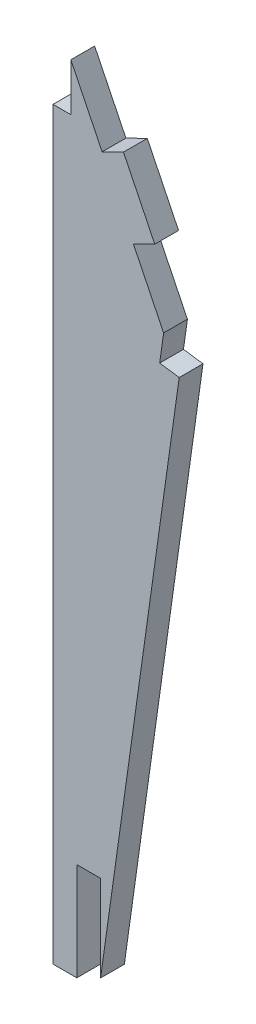
ISO-10303-21;
HEADER;
FILE_DESCRIPTION(('STEP AP214'),'2;1');
FILE_NAME('part.step','',(''),(''),'','','');
FILE_SCHEMA(('AUTOMOTIVE_DESIGN { 1 0 10303 214 1 1 1 1 }'));
ENDSEC;
DATA;
#1=APPLICATION_CONTEXT('core data for automotive mechanical design processes');
#2=APPLICATION_PROTOCOL_DEFINITION('international standard','automotive_design',2000,#1);
#3=PRODUCT_CONTEXT('',#1,'mechanical');
#4=PRODUCT('Part','Part','',(#3));
#5=PRODUCT_RELATED_PRODUCT_CATEGORY('part','',(#4));
#6=PRODUCT_DEFINITION_FORMATION('','',#4);
#7=PRODUCT_DEFINITION_CONTEXT('part definition',#1,'design');
#8=PRODUCT_DEFINITION('design','',#6,#7);
#9=PRODUCT_DEFINITION_SHAPE('','',#8);
#10=(LENGTH_UNIT() NAMED_UNIT(*) SI_UNIT(.MILLI.,.METRE.));
#11=(NAMED_UNIT(*) PLANE_ANGLE_UNIT() SI_UNIT($,.RADIAN.));
#12=(NAMED_UNIT(*) SI_UNIT($,.STERADIAN.) SOLID_ANGLE_UNIT());
#13=UNCERTAINTY_MEASURE_WITH_UNIT(LENGTH_MEASURE(1.E-05),#10,'distance_accuracy_value','');
#14=(GEOMETRIC_REPRESENTATION_CONTEXT(3) GLOBAL_UNCERTAINTY_ASSIGNED_CONTEXT((#13)) GLOBAL_UNIT_ASSIGNED_CONTEXT((#10,
#11,#12)) REPRESENTATION_CONTEXT('',''));
#15=CARTESIAN_POINT('',(0.,0.,0.));
#16=DIRECTION('',(0.,0.,1.));
#17=DIRECTION('',(1.,0.,0.));
#18=AXIS2_PLACEMENT_3D('',#15,#16,#17);
#19=CARTESIAN_POINT('',(17.3434518325957,74.7027953008437,2.));
#20=DIRECTION('',(-0.898794046260025,-0.438371146869329,0.));
#21=DIRECTION('',(0.438371146869329,-0.898794046260025,0.));
#22=AXIS2_PLACEMENT_3D('',#19,#20,#21);
#23=PLANE('',#22);
#24=DIRECTION('',(-0.438371146869329,0.898794046260025,0.));
#25=VECTOR('',#24,1.);
#26=CARTESIAN_POINT('',(17.3434518325957,74.7027953008437,0.));
#27=LINE('',#26,#25);
#28=CARTESIAN_POINT('',(19.9736787138118,69.3100310232835,0.));
#29=VERTEX_POINT('',#28);
#30=CARTESIAN_POINT('',(17.3434518325957,74.7027953008437,0.));
#31=VERTEX_POINT('',#30);
#32=EDGE_CURVE('E174',#29,#31,#27,.T.);
#33=ORIENTED_EDGE('',*,*,#32,.T.);
#34=DIRECTION('',(0.,0.,-1.));
#35=VECTOR('',#34,1.);
#36=CARTESIAN_POINT('',(17.3434518325957,74.7027953008437,2.));
#37=LINE('',#36,#35);
#38=CARTESIAN_POINT('',(17.3434518325957,74.7027953008437,2.));
#39=VERTEX_POINT('',#38);
#40=EDGE_CURVE('E11',#39,#31,#37,.T.);
#41=ORIENTED_EDGE('',*,*,#40,.F.);
#42=DIRECTION('',(-0.438371146869329,0.898794046260025,0.));
#43=VECTOR('',#42,1.);
#44=CARTESIAN_POINT('',(17.3434518325957,74.7027953008437,2.));
#45=LINE('',#44,#43);
#46=CARTESIAN_POINT('',(19.9736787138118,69.3100310232835,2.));
#47=VERTEX_POINT('',#46);
#48=EDGE_CURVE('E202',#47,#39,#45,.T.);
#49=ORIENTED_EDGE('',*,*,#48,.F.);
#50=DIRECTION('',(0.,0.,-1.));
#51=VECTOR('',#50,1.);
#52=CARTESIAN_POINT('',(19.9736787138118,69.3100310232835,2.));
#53=LINE('',#52,#51);
#54=EDGE_CURVE('E170',#47,#29,#53,.T.);
#55=ORIENTED_EDGE('',*,*,#54,.T.);
#56=EDGE_LOOP('',(#33,#41,#49,#55));
#57=FACE_BOUND('',#56,.T.);
#58=ADVANCED_FACE('F36',(#57),#23,.F.);
#59=CARTESIAN_POINT('',(17.3434518325957,74.7027953008437,2.));
#60=DIRECTION('',(1.,0.,0.));
#61=DIRECTION('',(0.,0.,-1.));
#62=AXIS2_PLACEMENT_3D('',#59,#60,#61);
#63=PLANE('',#62);
#64=DIRECTION('',(0.,-1.,0.));
#65=VECTOR('',#64,1.);
#66=CARTESIAN_POINT('',(17.3434518325957,74.7027953008437,0.));
#67=LINE('',#66,#65);
#68=CARTESIAN_POINT('',(17.3434518325957,70.7027953008437,0.));
#69=VERTEX_POINT('',#68);
#70=EDGE_CURVE('E177',#31,#69,#67,.T.);
#71=ORIENTED_EDGE('',*,*,#70,.T.);
#72=DIRECTION('',(0.,0.,-1.));
#73=VECTOR('',#72,1.);
#74=CARTESIAN_POINT('',(17.3434518325957,70.7027953008437,2.));
#75=LINE('',#74,#73);
#76=CARTESIAN_POINT('',(17.3434518325957,70.7027953008437,2.));
#77=VERTEX_POINT('',#76);
#78=EDGE_CURVE('E44',#77,#69,#75,.T.);
#79=ORIENTED_EDGE('',*,*,#78,.F.);
#80=DIRECTION('',(0.,-1.,0.));
#81=VECTOR('',#80,1.);
#82=CARTESIAN_POINT('',(17.3434518325957,74.7027953008437,2.));
#83=LINE('',#82,#81);
#84=EDGE_CURVE('E116',#39,#77,#83,.T.);
#85=ORIENTED_EDGE('',*,*,#84,.F.);
#86=ORIENTED_EDGE('',*,*,#40,.T.);
#87=EDGE_LOOP('',(#71,#79,#85,#86));
#88=FACE_BOUND('',#87,.T.);
#89=ADVANCED_FACE('F295',(#88),#63,.F.);
#90=CARTESIAN_POINT('',(17.3434518325957,70.7027953008437,2.));
#91=DIRECTION('',(0.,-1.,0.));
#92=DIRECTION('',(0.,0.,-1.));
#93=AXIS2_PLACEMENT_3D('',#90,#91,#92);
#94=PLANE('',#93);
#95=DIRECTION('',(-1.,0.,0.));
#96=VECTOR('',#95,1.);
#97=CARTESIAN_POINT('',(17.3434518325957,70.7027953008437,0.));
#98=LINE('',#97,#96);
#99=CARTESIAN_POINT('',(15.8434518325957,70.7027953008437,0.));
#100=VERTEX_POINT('',#99);
#101=EDGE_CURVE('E179',#69,#100,#98,.T.);
#102=ORIENTED_EDGE('',*,*,#101,.T.);
#103=DIRECTION('',(0.,0.,-1.));
#104=VECTOR('',#103,1.);
#105=CARTESIAN_POINT('',(15.8434518325957,70.7027953008437,2.));
#106=LINE('',#105,#104);
#107=CARTESIAN_POINT('',(15.8434518325957,70.7027953008437,2.));
#108=VERTEX_POINT('',#107);
#109=EDGE_CURVE('E230',#108,#100,#106,.T.);
#110=ORIENTED_EDGE('',*,*,#109,.F.);
#111=DIRECTION('',(-1.,0.,0.));
#112=VECTOR('',#111,1.);
#113=CARTESIAN_POINT('',(17.3434518325957,70.7027953008437,2.));
#114=LINE('',#113,#112);
#115=EDGE_CURVE('E238',#77,#108,#114,.T.);
#116=ORIENTED_EDGE('',*,*,#115,.F.);
#117=ORIENTED_EDGE('',*,*,#78,.T.);
#118=EDGE_LOOP('',(#102,#110,#116,#117));
#119=FACE_BOUND('',#118,.T.);
#120=ADVANCED_FACE('F236',(#119),#94,.F.);
#121=CARTESIAN_POINT('',(15.8434518325957,70.7027953008437,2.));
#122=DIRECTION('',(1.,0.,0.));
#123=DIRECTION('',(0.,0.,-1.));
#124=AXIS2_PLACEMENT_3D('',#121,#122,#123);
#125=PLANE('',#124);
#126=DIRECTION('',(0.,-1.,0.));
#127=VECTOR('',#126,1.);
#128=CARTESIAN_POINT('',(15.8434518325957,70.7027953008437,0.));
#129=LINE('',#128,#127);
#130=CARTESIAN_POINT('',(15.8434518325957,8.08014643010893,0.));
#131=VERTEX_POINT('',#130);
#132=EDGE_CURVE('E181',#100,#131,#129,.T.);
#133=ORIENTED_EDGE('',*,*,#132,.T.);
#134=DIRECTION('',(0.,0.,-1.));
#135=VECTOR('',#134,1.);
#136=CARTESIAN_POINT('',(15.8434518325957,8.08014643010893,2.));
#137=LINE('',#136,#135);
#138=CARTESIAN_POINT('',(15.8434518325957,8.08014643010893,2.));
#139=VERTEX_POINT('',#138);
#140=EDGE_CURVE('E227',#139,#131,#137,.T.);
#141=ORIENTED_EDGE('',*,*,#140,.F.);
#142=DIRECTION('',(0.,-1.,0.));
#143=VECTOR('',#142,1.);
#144=CARTESIAN_POINT('',(15.8434518325957,70.7027953008437,2.));
#145=LINE('',#144,#143);
#146=EDGE_CURVE('E256',#108,#139,#145,.T.);
#147=ORIENTED_EDGE('',*,*,#146,.F.);
#148=ORIENTED_EDGE('',*,*,#109,.T.);
#149=EDGE_LOOP('',(#133,#141,#147,#148));
#150=FACE_BOUND('',#149,.T.);
#151=ADVANCED_FACE('F247',(#150),#125,.F.);
#152=CARTESIAN_POINT('',(15.8434518325957,8.08014643010893,2.));
#153=DIRECTION('',(0.,1.,0.));
#154=DIRECTION('',(0.,0.,1.));
#155=AXIS2_PLACEMENT_3D('',#152,#153,#154);
#156=PLANE('',#155);
#157=DIRECTION('',(1.,0.,0.));
#158=VECTOR('',#157,1.);
#159=CARTESIAN_POINT('',(15.8434518325957,8.08014643010893,0.));
#160=LINE('',#159,#158);
#161=CARTESIAN_POINT('',(17.8434518325958,8.08014643010893,0.));
#162=VERTEX_POINT('',#161);
#163=EDGE_CURVE('E183',#131,#162,#160,.T.);
#164=ORIENTED_EDGE('',*,*,#163,.T.);
#165=DIRECTION('',(0.,0.,-1.));
#166=VECTOR('',#165,1.);
#167=CARTESIAN_POINT('',(17.8434518325958,8.08014643010893,2.));
#168=LINE('',#167,#166);
#169=CARTESIAN_POINT('',(17.8434518325958,8.08014643010893,2.));
#170=VERTEX_POINT('',#169);
#171=EDGE_CURVE('E224',#170,#162,#168,.T.);
#172=ORIENTED_EDGE('',*,*,#171,.F.);
#173=DIRECTION('',(1.,0.,0.));
#174=VECTOR('',#173,1.);
#175=CARTESIAN_POINT('',(15.8434518325957,8.08014643010893,2.));
#176=LINE('',#175,#174);
#177=EDGE_CURVE('E253',#139,#170,#176,.T.);
#178=ORIENTED_EDGE('',*,*,#177,.F.);
#179=ORIENTED_EDGE('',*,*,#140,.T.);
#180=EDGE_LOOP('',(#164,#172,#178,#179));
#181=FACE_BOUND('',#180,.T.);
#182=ADVANCED_FACE('F251',(#181),#156,.F.);
#183=CARTESIAN_POINT('',(17.8434518325958,8.08014643010893,2.));
#184=DIRECTION('',(-1.,0.,0.));
#185=DIRECTION('',(0.,0.,1.));
#186=AXIS2_PLACEMENT_3D('',#183,#184,#185);
#187=PLANE('',#186);
#188=DIRECTION('',(0.,1.,0.));
#189=VECTOR('',#188,1.);
#190=CARTESIAN_POINT('',(17.8434518325958,8.08014643010893,0.));
#191=LINE('',#190,#189);
#192=CARTESIAN_POINT('',(17.8434518325958,16.3301464301089,0.));
#193=VERTEX_POINT('',#192);
#194=EDGE_CURVE('E185',#162,#193,#191,.T.);
#195=ORIENTED_EDGE('',*,*,#194,.T.);
#196=DIRECTION('',(0.,0.,-1.));
#197=VECTOR('',#196,1.);
#198=CARTESIAN_POINT('',(17.8434518325958,16.3301464301089,2.));
#199=LINE('',#198,#197);
#200=CARTESIAN_POINT('',(17.8434518325958,16.3301464301089,2.));
#201=VERTEX_POINT('',#200);
#202=EDGE_CURVE('E221',#201,#193,#199,.T.);
#203=ORIENTED_EDGE('',*,*,#202,.F.);
#204=DIRECTION('',(0.,1.,0.));
#205=VECTOR('',#204,1.);
#206=CARTESIAN_POINT('',(17.8434518325958,8.08014643010893,2.));
#207=LINE('',#206,#205);
#208=EDGE_CURVE('E255',#170,#201,#207,.T.);
#209=ORIENTED_EDGE('',*,*,#208,.F.);
#210=ORIENTED_EDGE('',*,*,#171,.T.);
#211=EDGE_LOOP('',(#195,#203,#209,#210));
#212=FACE_BOUND('',#211,.T.);
#213=ADVANCED_FACE('F308',(#212),#187,.F.);
#214=CARTESIAN_POINT('',(17.8434518325958,16.3301464301089,2.));
#215=DIRECTION('',(0.,1.,0.));
#216=DIRECTION('',(0.,0.,1.));
#217=AXIS2_PLACEMENT_3D('',#214,#215,#216);
#218=PLANE('',#217);
#219=DIRECTION('',(1.,0.,0.));
#220=VECTOR('',#219,1.);
#221=CARTESIAN_POINT('',(17.8434518325958,16.3301464301089,0.));
#222=LINE('',#221,#220);
#223=CARTESIAN_POINT('',(19.8434518325957,16.3301464301089,0.));
#224=VERTEX_POINT('',#223);
#225=EDGE_CURVE('E187',#193,#224,#222,.T.);
#226=ORIENTED_EDGE('',*,*,#225,.T.);
#227=DIRECTION('',(0.,0.,-1.));
#228=VECTOR('',#227,1.);
#229=CARTESIAN_POINT('',(19.8434518325957,16.3301464301089,2.));
#230=LINE('',#229,#228);
#231=CARTESIAN_POINT('',(19.8434518325957,16.3301464301089,2.));
#232=VERTEX_POINT('',#231);
#233=EDGE_CURVE('E218',#232,#224,#230,.T.);
#234=ORIENTED_EDGE('',*,*,#233,.F.);
#235=DIRECTION('',(1.,0.,0.));
#236=VECTOR('',#235,1.);
#237=CARTESIAN_POINT('',(17.8434518325958,16.3301464301089,2.));
#238=LINE('',#237,#236);
#239=EDGE_CURVE('E258',#201,#232,#238,.T.);
#240=ORIENTED_EDGE('',*,*,#239,.F.);
#241=ORIENTED_EDGE('',*,*,#202,.T.);
#242=EDGE_LOOP('',(#226,#234,#240,#241));
#243=FACE_BOUND('',#242,.T.);
#244=ADVANCED_FACE('F311',(#243),#218,.F.);
#245=CARTESIAN_POINT('',(19.8434518325957,16.3301464301089,2.));
#246=DIRECTION('',(1.,0.,0.));
#247=DIRECTION('',(0.,0.,-1.));
#248=AXIS2_PLACEMENT_3D('',#245,#246,#247);
#249=PLANE('',#248);
#250=DIRECTION('',(0.,-1.,0.));
#251=VECTOR('',#250,1.);
#252=CARTESIAN_POINT('',(19.8434518325957,16.3301464301089,0.));
#253=LINE('',#252,#251);
#254=CARTESIAN_POINT('',(19.8434518325957,9.06845485355871,0.));
#255=VERTEX_POINT('',#254);
#256=EDGE_CURVE('E189',#224,#255,#253,.T.);
#257=ORIENTED_EDGE('',*,*,#256,.T.);
#258=DIRECTION('',(0.,0.,-1.));
#259=VECTOR('',#258,1.);
#260=CARTESIAN_POINT('',(19.8434518325957,9.06845485355871,2.));
#261=LINE('',#260,#259);
#262=CARTESIAN_POINT('',(19.8434518325957,9.06845485355871,2.));
#263=VERTEX_POINT('',#262);
#264=EDGE_CURVE('E215',#263,#255,#261,.T.);
#265=ORIENTED_EDGE('',*,*,#264,.F.);
#266=DIRECTION('',(0.,-1.,0.));
#267=VECTOR('',#266,1.);
#268=CARTESIAN_POINT('',(19.8434518325957,16.3301464301089,2.));
#269=LINE('',#268,#267);
#270=EDGE_CURVE('E264',#232,#263,#269,.T.);
#271=ORIENTED_EDGE('',*,*,#270,.F.);
#272=ORIENTED_EDGE('',*,*,#233,.T.);
#273=EDGE_LOOP('',(#257,#265,#271,#272));
#274=FACE_BOUND('',#273,.T.);
#275=ADVANCED_FACE('F315',(#274),#249,.F.);
#276=CARTESIAN_POINT('',(19.8434518325957,9.06845485355871,2.));
#277=DIRECTION('',(-0.990265073893101,0.139194408750825,0.));
#278=DIRECTION('',(-0.139194408750825,-0.990265073893101,0.));
#279=AXIS2_PLACEMENT_3D('',#276,#277,#278);
#280=PLANE('',#279);
#281=DIRECTION('',(0.139194408750825,0.990265073893101,0.));
#282=VECTOR('',#281,1.);
#283=CARTESIAN_POINT('',(19.8434518325957,9.06845485355871,0.));
#284=LINE('',#283,#282);
#285=CARTESIAN_POINT('',(26.4563530798214,56.1143470054076,0.));
#286=VERTEX_POINT('',#285);
#287=EDGE_CURVE('E191',#255,#286,#284,.T.);
#288=ORIENTED_EDGE('',*,*,#287,.T.);
#289=DIRECTION('',(0.,0.,-1.));
#290=VECTOR('',#289,1.);
#291=CARTESIAN_POINT('',(26.4563530798214,56.1143470054076,2.));
#292=LINE('',#291,#290);
#293=CARTESIAN_POINT('',(26.4563530798214,56.1143470054076,2.));
#294=VERTEX_POINT('',#293);
#295=EDGE_CURVE('E212',#294,#286,#292,.T.);
#296=ORIENTED_EDGE('',*,*,#295,.F.);
#297=DIRECTION('',(0.139194408750825,0.990265073893101,0.));
#298=VECTOR('',#297,1.);
#299=CARTESIAN_POINT('',(19.8434518325957,9.06845485355871,2.));
#300=LINE('',#299,#298);
#301=EDGE_CURVE('E266',#263,#294,#300,.T.);
#302=ORIENTED_EDGE('',*,*,#301,.F.);
#303=ORIENTED_EDGE('',*,*,#264,.T.);
#304=EDGE_LOOP('',(#288,#296,#302,#303));
#305=FACE_BOUND('',#304,.T.);
#306=ADVANCED_FACE('F319',(#305),#280,.F.);
#307=CARTESIAN_POINT('',(26.4563530798214,56.1143470054076,2.));
#308=DIRECTION('',(-0.139460772136206,-0.990227596583317,0.));
#309=DIRECTION('',(0.990227596583317,-0.139460772136206,0.));
#310=AXIS2_PLACEMENT_3D('',#307,#308,#309);
#311=PLANE('',#310);
#312=DIRECTION('',(-0.990227596583317,0.139460772136206,0.));
#313=VECTOR('',#312,1.);
#314=CARTESIAN_POINT('',(26.4563530798214,56.1143470054076,0.));
#315=LINE('',#314,#313);
#316=CARTESIAN_POINT('',(24.814803102091,56.3455381256958,0.));
#317=VERTEX_POINT('',#316);
#318=EDGE_CURVE('E193',#286,#317,#315,.T.);
#319=ORIENTED_EDGE('',*,*,#318,.T.);
#320=DIRECTION('',(0.,0.,-1.));
#321=VECTOR('',#320,1.);
#322=CARTESIAN_POINT('',(24.814803102091,56.3455381256958,2.));
#323=LINE('',#322,#321);
#324=CARTESIAN_POINT('',(24.814803102091,56.3455381256958,2.));
#325=VERTEX_POINT('',#324);
#326=EDGE_CURVE('E209',#325,#317,#323,.T.);
#327=ORIENTED_EDGE('',*,*,#326,.F.);
#328=DIRECTION('',(-0.990227596583317,0.139460772136206,0.));
#329=VECTOR('',#328,1.);
#330=CARTESIAN_POINT('',(26.4563530798214,56.1143470054076,2.));
#331=LINE('',#330,#329);
#332=EDGE_CURVE('E268',#294,#325,#331,.T.);
#333=ORIENTED_EDGE('',*,*,#332,.F.);
#334=ORIENTED_EDGE('',*,*,#295,.T.);
#335=EDGE_LOOP('',(#319,#327,#333,#334));
#336=FACE_BOUND('',#335,.T.);
#337=ADVANCED_FACE('F323',(#336),#311,.F.);
#338=CARTESIAN_POINT('',(24.814803102091,56.3455381256958,2.));
#339=DIRECTION('',(-0.990227596822041,0.139460770441171,0.));
#340=DIRECTION('',(-0.139460770441171,-0.990227596822041,0.));
#341=AXIS2_PLACEMENT_3D('',#338,#339,#340);
#342=PLANE('',#341);
#343=DIRECTION('',(0.139460770441171,0.990227596822041,0.));
#344=VECTOR('',#343,1.);
#345=CARTESIAN_POINT('',(24.814803102091,56.3455381256958,0.));
#346=LINE('',#345,#344);
#347=CARTESIAN_POINT('',(25.1468776841657,58.703401303515,0.));
#348=VERTEX_POINT('',#347);
#349=EDGE_CURVE('E195',#317,#348,#346,.T.);
#350=ORIENTED_EDGE('',*,*,#349,.T.);
#351=DIRECTION('',(0.,0.,-1.));
#352=VECTOR('',#351,1.);
#353=CARTESIAN_POINT('',(25.1468776841657,58.703401303515,2.));
#354=LINE('',#353,#352);
#355=CARTESIAN_POINT('',(25.1468776841657,58.703401303515,2.));
#356=VERTEX_POINT('',#355);
#357=EDGE_CURVE('E206',#356,#348,#354,.T.);
#358=ORIENTED_EDGE('',*,*,#357,.F.);
#359=DIRECTION('',(0.139460770441171,0.990227596822041,0.));
#360=VECTOR('',#359,1.);
#361=CARTESIAN_POINT('',(24.814803102091,56.3455381256958,2.));
#362=LINE('',#361,#360);
#363=EDGE_CURVE('E270',#325,#356,#362,.T.);
#364=ORIENTED_EDGE('',*,*,#363,.F.);
#365=ORIENTED_EDGE('',*,*,#326,.T.);
#366=EDGE_LOOP('',(#350,#358,#364,#365));
#367=FACE_BOUND('',#366,.T.);
#368=ADVANCED_FACE('F276',(#367),#342,.F.);
#369=CARTESIAN_POINT('',(22.6039055945466,63.9172667454882,2.));
#370=DIRECTION('',(-0.898794046219606,-0.438371146952202,0.));
#371=DIRECTION('',(0.438371146952202,-0.898794046219606,0.));
#372=AXIS2_PLACEMENT_3D('',#369,#370,#371);
#373=PLANE('',#372);
#374=DIRECTION('',(-0.438371146952202,0.898794046219606,0.));
#375=VECTOR('',#374,1.);
#376=CARTESIAN_POINT('',(22.6039055945466,63.9172667454882,0.));
#377=LINE('',#376,#375);
#378=CARTESIAN_POINT('',(22.6039055945466,63.9172667454882,0.));
#379=VERTEX_POINT('',#378);
#380=EDGE_CURVE('E197',#348,#379,#377,.T.);
#381=ORIENTED_EDGE('',*,*,#380,.T.);
#382=DIRECTION('',(0.,0.,-1.));
#383=VECTOR('',#382,1.);
#384=CARTESIAN_POINT('',(22.6039055945466,63.9172667454882,2.));
#385=LINE('',#384,#383);
#386=CARTESIAN_POINT('',(22.6039055945466,63.9172667454882,2.));
#387=VERTEX_POINT('',#386);
#388=EDGE_CURVE('E165',#387,#379,#385,.T.);
#389=ORIENTED_EDGE('',*,*,#388,.F.);
#390=DIRECTION('',(-0.438371146952202,0.898794046219606,0.));
#391=VECTOR('',#390,1.);
#392=CARTESIAN_POINT('',(22.6039055945466,63.9172667454882,2.));
#393=LINE('',#392,#391);
#394=EDGE_CURVE('E156',#356,#387,#393,.T.);
#395=ORIENTED_EDGE('',*,*,#394,.F.);
#396=ORIENTED_EDGE('',*,*,#357,.T.);
#397=EDGE_LOOP('',(#381,#389,#395,#396));
#398=FACE_BOUND('',#397,.T.);
#399=ADVANCED_FACE('F280',(#398),#373,.F.);
#400=CARTESIAN_POINT('',(24.4014936866643,64.7940090388315,2.));
#401=DIRECTION('',(-0.438371146788932,0.898794046299238,0.));
#402=DIRECTION('',(-0.898794046299238,-0.438371146788932,0.));
#403=AXIS2_PLACEMENT_3D('',#400,#401,#402);
#404=PLANE('',#403);
#405=DIRECTION('',(0.898794046299238,0.438371146788932,0.));
#406=VECTOR('',#405,1.);
#407=CARTESIAN_POINT('',(24.4014936866643,64.7940090388315,0.));
#408=LINE('',#407,#406);
#409=CARTESIAN_POINT('',(24.4014936866643,64.7940090388315,0.));
#410=VERTEX_POINT('',#409);
#411=EDGE_CURVE('E164',#379,#410,#408,.T.);
#412=ORIENTED_EDGE('',*,*,#411,.T.);
#413=DIRECTION('',(0.,0.,-1.));
#414=VECTOR('',#413,1.);
#415=CARTESIAN_POINT('',(24.4014936866643,64.7940090388315,2.));
#416=LINE('',#415,#414);
#417=CARTESIAN_POINT('',(24.4014936866643,64.7940090388315,2.));
#418=VERTEX_POINT('',#417);
#419=EDGE_CURVE('E161',#418,#410,#416,.T.);
#420=ORIENTED_EDGE('',*,*,#419,.F.);
#421=DIRECTION('',(0.898794046299238,0.438371146788932,0.));
#422=VECTOR('',#421,1.);
#423=CARTESIAN_POINT('',(24.4014936866643,64.7940090388315,2.));
#424=LINE('',#423,#422);
#425=EDGE_CURVE('E150',#387,#418,#424,.T.);
#426=ORIENTED_EDGE('',*,*,#425,.F.);
#427=ORIENTED_EDGE('',*,*,#388,.T.);
#428=EDGE_LOOP('',(#412,#420,#426,#427));
#429=FACE_BOUND('',#428,.T.);
#430=ADVANCED_FACE('F162',(#429),#404,.F.);
#431=CARTESIAN_POINT('',(21.7712668059294,70.1867733166268,2.));
#432=DIRECTION('',(-0.89879404629915,-0.438371146789112,0.));
#433=DIRECTION('',(0.438371146789112,-0.89879404629915,0.));
#434=AXIS2_PLACEMENT_3D('',#431,#432,#433);
#435=PLANE('',#434);
#436=DIRECTION('',(-0.438371146789112,0.89879404629915,0.));
#437=VECTOR('',#436,1.);
#438=CARTESIAN_POINT('',(21.7712668059294,70.1867733166268,0.));
#439=LINE('',#438,#437);
#440=CARTESIAN_POINT('',(21.7712668059294,70.1867733166268,0.));
#441=VERTEX_POINT('',#440);
#442=EDGE_CURVE('E102',#410,#441,#439,.T.);
#443=ORIENTED_EDGE('',*,*,#442,.T.);
#444=DIRECTION('',(0.,0.,-1.));
#445=VECTOR('',#444,1.);
#446=CARTESIAN_POINT('',(21.7712668059294,70.1867733166268,2.));
#447=LINE('',#446,#445);
#448=CARTESIAN_POINT('',(21.7712668059294,70.1867733166268,2.));
#449=VERTEX_POINT('',#448);
#450=EDGE_CURVE('E166',#449,#441,#447,.T.);
#451=ORIENTED_EDGE('',*,*,#450,.F.);
#452=DIRECTION('',(-0.438371146789112,0.89879404629915,0.));
#453=VECTOR('',#452,1.);
#454=CARTESIAN_POINT('',(21.7712668059294,70.1867733166268,2.));
#455=LINE('',#454,#453);
#456=EDGE_CURVE('E154',#418,#449,#455,.T.);
#457=ORIENTED_EDGE('',*,*,#456,.F.);
#458=ORIENTED_EDGE('',*,*,#419,.T.);
#459=EDGE_LOOP('',(#443,#451,#457,#458));
#460=FACE_BOUND('',#459,.T.);
#461=ADVANCED_FACE('F168',(#460),#435,.F.);
#462=CARTESIAN_POINT('',(19.9736787138118,69.3100310232835,2.));
#463=DIRECTION('',(0.438371146788932,-0.898794046299238,0.));
#464=DIRECTION('',(0.898794046299238,0.438371146788932,0.));
#465=AXIS2_PLACEMENT_3D('',#462,#463,#464);
#466=PLANE('',#465);
#467=DIRECTION('',(-0.898794046299238,-0.438371146788932,0.));
#468=VECTOR('',#467,1.);
#469=CARTESIAN_POINT('',(19.9736787138118,69.3100310232835,0.));
#470=LINE('',#469,#468);
#471=EDGE_CURVE('E108',#441,#29,#470,.T.);
#472=ORIENTED_EDGE('',*,*,#471,.T.);
#473=ORIENTED_EDGE('',*,*,#54,.F.);
#474=DIRECTION('',(-0.898794046299238,-0.438371146788932,0.));
#475=VECTOR('',#474,1.);
#476=CARTESIAN_POINT('',(19.9736787138118,69.3100310232835,2.));
#477=LINE('',#476,#475);
#478=EDGE_CURVE('E52',#449,#47,#477,.T.);
#479=ORIENTED_EDGE('',*,*,#478,.F.);
#480=ORIENTED_EDGE('',*,*,#450,.T.);
#481=EDGE_LOOP('',(#472,#473,#479,#480));
#482=FACE_BOUND('',#481,.T.);
#483=ADVANCED_FACE('F284',(#482),#466,.F.);
#484=CARTESIAN_POINT('',(0.,0.,2.));
#485=DIRECTION('',(0.,0.,1.));
#486=DIRECTION('',(1.,0.,0.));
#487=AXIS2_PLACEMENT_3D('',#484,#485,#486);
#488=PLANE('',#487);
#489=ORIENTED_EDGE('',*,*,#48,.T.);
#490=ORIENTED_EDGE('',*,*,#84,.T.);
#491=ORIENTED_EDGE('',*,*,#115,.T.);
#492=ORIENTED_EDGE('',*,*,#146,.T.);
#493=ORIENTED_EDGE('',*,*,#177,.T.);
#494=ORIENTED_EDGE('',*,*,#208,.T.);
#495=ORIENTED_EDGE('',*,*,#239,.T.);
#496=ORIENTED_EDGE('',*,*,#270,.T.);
#497=ORIENTED_EDGE('',*,*,#301,.T.);
#498=ORIENTED_EDGE('',*,*,#332,.T.);
#499=ORIENTED_EDGE('',*,*,#363,.T.);
#500=ORIENTED_EDGE('',*,*,#394,.T.);
#501=ORIENTED_EDGE('',*,*,#425,.T.);
#502=ORIENTED_EDGE('',*,*,#456,.T.);
#503=ORIENTED_EDGE('',*,*,#478,.T.);
#504=EDGE_LOOP('',(#489,#490,#491,#492,#493,#494,#495,#496,#497,#498,#499,#500,#501,#502,#503));
#505=FACE_BOUND('',#504,.T.);
#506=ADVANCED_FACE('F152',(#505),#488,.T.);
#507=CARTESIAN_POINT('',(0.,0.,0.));
#508=DIRECTION('',(0.,0.,1.));
#509=DIRECTION('',(1.,0.,0.));
#510=AXIS2_PLACEMENT_3D('',#507,#508,#509);
#511=PLANE('',#510);
#512=ORIENTED_EDGE('',*,*,#32,.F.);
#513=ORIENTED_EDGE('',*,*,#471,.F.);
#514=ORIENTED_EDGE('',*,*,#442,.F.);
#515=ORIENTED_EDGE('',*,*,#411,.F.);
#516=ORIENTED_EDGE('',*,*,#380,.F.);
#517=ORIENTED_EDGE('',*,*,#349,.F.);
#518=ORIENTED_EDGE('',*,*,#318,.F.);
#519=ORIENTED_EDGE('',*,*,#287,.F.);
#520=ORIENTED_EDGE('',*,*,#256,.F.);
#521=ORIENTED_EDGE('',*,*,#225,.F.);
#522=ORIENTED_EDGE('',*,*,#194,.F.);
#523=ORIENTED_EDGE('',*,*,#163,.F.);
#524=ORIENTED_EDGE('',*,*,#132,.F.);
#525=ORIENTED_EDGE('',*,*,#101,.F.);
#526=ORIENTED_EDGE('',*,*,#70,.F.);
#527=EDGE_LOOP('',(#512,#513,#514,#515,#516,#517,#518,#519,#520,#521,#522,#523,#524,#525,#526));
#528=FACE_BOUND('',#527,.T.);
#529=ADVANCED_FACE('F242',(#528),#511,.F.);
#530=CLOSED_SHELL('',(#58,#89,#120,#151,#182,#213,#244,#275,#306,#337,#368,#399,#430,#461,#483,
#506,#529));
#531=MANIFOLD_SOLID_BREP('B2',#530);
#532=ADVANCED_BREP_SHAPE_REPRESENTATION('',(#18,#531),#14);
#533=SHAPE_DEFINITION_REPRESENTATION(#9,#532);
ENDSEC;
END-ISO-10303-21;
